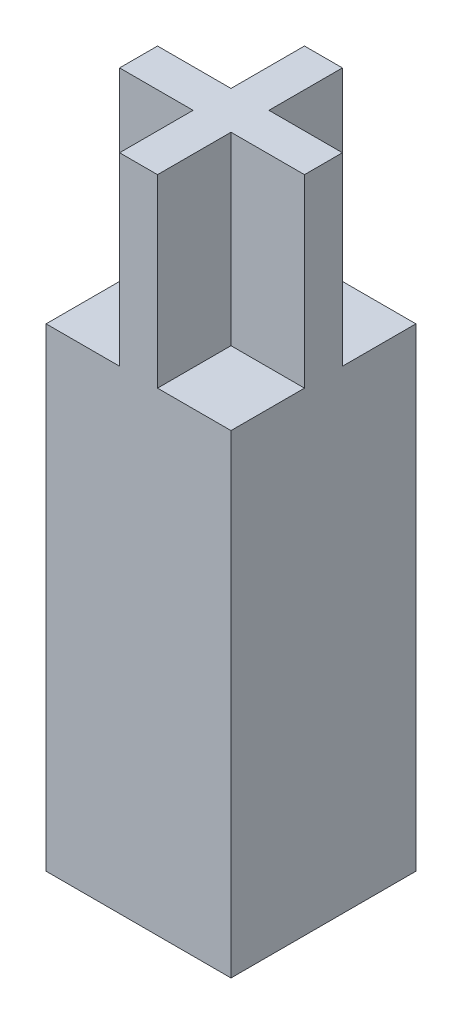
ISO-10303-21;
HEADER;
FILE_DESCRIPTION(('STEP AP214'),'2;1');
FILE_NAME('part.step','',(''),(''),'','','');
FILE_SCHEMA(('AUTOMOTIVE_DESIGN { 1 0 10303 214 1 1 1 1 }'));
ENDSEC;
DATA;
#1=APPLICATION_CONTEXT('core data for automotive mechanical design processes');
#2=APPLICATION_PROTOCOL_DEFINITION('international standard','automotive_design',2000,#1);
#3=PRODUCT_CONTEXT('',#1,'mechanical');
#4=PRODUCT('Part','Part','',(#3));
#5=PRODUCT_RELATED_PRODUCT_CATEGORY('part','',(#4));
#6=PRODUCT_DEFINITION_FORMATION('','',#4);
#7=PRODUCT_DEFINITION_CONTEXT('part definition',#1,'design');
#8=PRODUCT_DEFINITION('design','',#6,#7);
#9=PRODUCT_DEFINITION_SHAPE('','',#8);
#10=(LENGTH_UNIT() NAMED_UNIT(*) SI_UNIT(.MILLI.,.METRE.));
#11=(NAMED_UNIT(*) PLANE_ANGLE_UNIT() SI_UNIT($,.RADIAN.));
#12=(NAMED_UNIT(*) SI_UNIT($,.STERADIAN.) SOLID_ANGLE_UNIT());
#13=UNCERTAINTY_MEASURE_WITH_UNIT(LENGTH_MEASURE(1.E-05),#10,'distance_accuracy_value','');
#14=(GEOMETRIC_REPRESENTATION_CONTEXT(3) GLOBAL_UNCERTAINTY_ASSIGNED_CONTEXT((#13)) GLOBAL_UNIT_ASSIGNED_CONTEXT((#10,
#11,#12)) REPRESENTATION_CONTEXT('',''));
#15=CARTESIAN_POINT('',(0.,0.,0.));
#16=DIRECTION('',(0.,0.,1.));
#17=DIRECTION('',(1.,0.,0.));
#18=AXIS2_PLACEMENT_3D('',#15,#16,#17);
#19=CARTESIAN_POINT('',(1.95,3.9,0.4));
#20=DIRECTION('',(0.,0.,1.));
#21=DIRECTION('',(1.,0.,0.));
#22=AXIS2_PLACEMENT_3D('',#19,#20,#21);
#23=PLANE('',#22);
#24=DIRECTION('',(0.,1.,0.));
#25=VECTOR('',#24,1.);
#26=CARTESIAN_POINT('',(0.4,3.9,0.4));
#27=LINE('',#26,#25);
#28=CARTESIAN_POINT('',(0.4,0.,0.4));
#29=VERTEX_POINT('',#28);
#30=CARTESIAN_POINT('',(0.4,3.9,0.4));
#31=VERTEX_POINT('',#30);
#32=EDGE_CURVE('E181',#29,#31,#27,.T.);
#33=ORIENTED_EDGE('',*,*,#32,.F.);
#34=DIRECTION('',(-1.,0.,0.));
#35=VECTOR('',#34,1.);
#36=CARTESIAN_POINT('',(1.95,0.,0.4));
#37=LINE('',#36,#35);
#38=CARTESIAN_POINT('',(1.95,0.,0.4));
#39=VERTEX_POINT('',#38);
#40=EDGE_CURVE('E169',#39,#29,#37,.T.);
#41=ORIENTED_EDGE('',*,*,#40,.F.);
#42=DIRECTION('',(0.,-1.,0.));
#43=VECTOR('',#42,1.);
#44=CARTESIAN_POINT('',(1.95,3.9,0.4));
#45=LINE('',#44,#43);
#46=CARTESIAN_POINT('',(1.95,3.9,0.4));
#47=VERTEX_POINT('',#46);
#48=EDGE_CURVE('E115',#47,#39,#45,.T.);
#49=ORIENTED_EDGE('',*,*,#48,.F.);
#50=DIRECTION('',(-1.,0.,0.));
#51=VECTOR('',#50,1.);
#52=CARTESIAN_POINT('',(1.95,3.9,0.4));
#53=LINE('',#52,#51);
#54=EDGE_CURVE('E165',#47,#31,#53,.T.);
#55=ORIENTED_EDGE('',*,*,#54,.T.);
#56=EDGE_LOOP('',(#33,#41,#49,#55));
#57=FACE_BOUND('',#56,.T.);
#58=ADVANCED_FACE('F63',(#57),#23,.T.);
#59=CARTESIAN_POINT('',(1.95,3.9,-0.4));
#60=DIRECTION('',(1.,0.,0.));
#61=DIRECTION('',(0.,0.,-1.));
#62=AXIS2_PLACEMENT_3D('',#59,#60,#61);
#63=PLANE('',#62);
#64=ORIENTED_EDGE('',*,*,#48,.T.);
#65=DIRECTION('',(0.,0.,1.));
#66=VECTOR('',#65,1.);
#67=CARTESIAN_POINT('',(1.95,0.,-1.95));
#68=LINE('',#67,#66);
#69=CARTESIAN_POINT('',(1.95,0.,1.95));
#70=VERTEX_POINT('',#69);
#71=EDGE_CURVE('E336',#39,#70,#68,.T.);
#72=ORIENTED_EDGE('',*,*,#71,.T.);
#73=DIRECTION('',(0.,1.,0.));
#74=VECTOR('',#73,1.);
#75=CARTESIAN_POINT('',(1.95,-10.,1.95));
#76=LINE('',#75,#74);
#77=CARTESIAN_POINT('',(1.95,-10.,1.95));
#78=VERTEX_POINT('',#77);
#79=EDGE_CURVE('E218',#78,#70,#76,.T.);
#80=ORIENTED_EDGE('',*,*,#79,.F.);
#81=DIRECTION('',(0.,0.,1.));
#82=VECTOR('',#81,1.);
#83=CARTESIAN_POINT('',(1.95,-10.,-1.95));
#84=LINE('',#83,#82);
#85=CARTESIAN_POINT('',(1.95,-10.,-1.95));
#86=VERTEX_POINT('',#85);
#87=EDGE_CURVE('E259',#86,#78,#84,.T.);
#88=ORIENTED_EDGE('',*,*,#87,.F.);
#89=DIRECTION('',(0.,1.,0.));
#90=VECTOR('',#89,1.);
#91=CARTESIAN_POINT('',(1.95,-10.,-1.95));
#92=LINE('',#91,#90);
#93=CARTESIAN_POINT('',(1.95,0.,-1.95));
#94=VERTEX_POINT('',#93);
#95=EDGE_CURVE('E260',#86,#94,#92,.T.);
#96=ORIENTED_EDGE('',*,*,#95,.T.);
#97=CARTESIAN_POINT('',(1.95,0.,-0.4));
#98=VERTEX_POINT('',#97);
#99=EDGE_CURVE('E250',#94,#98,#68,.T.);
#100=ORIENTED_EDGE('',*,*,#99,.T.);
#101=DIRECTION('',(0.,-1.,0.));
#102=VECTOR('',#101,1.);
#103=CARTESIAN_POINT('',(1.95,3.9,-0.4));
#104=LINE('',#103,#102);
#105=CARTESIAN_POINT('',(1.95,3.9,-0.4));
#106=VERTEX_POINT('',#105);
#107=EDGE_CURVE('E178',#106,#98,#104,.T.);
#108=ORIENTED_EDGE('',*,*,#107,.F.);
#109=DIRECTION('',(0.,0.,1.));
#110=VECTOR('',#109,1.);
#111=CARTESIAN_POINT('',(1.95,3.9,-0.4));
#112=LINE('',#111,#110);
#113=EDGE_CURVE('E177',#106,#47,#112,.T.);
#114=ORIENTED_EDGE('',*,*,#113,.T.);
#115=EDGE_LOOP('',(#64,#72,#80,#88,#96,#100,#108,#114));
#116=FACE_BOUND('',#115,.T.);
#117=ADVANCED_FACE('F335',(#116),#63,.T.);
#118=CARTESIAN_POINT('',(1.95,3.9,-0.4));
#119=DIRECTION('',(0.,0.,1.));
#120=DIRECTION('',(1.,0.,0.));
#121=AXIS2_PLACEMENT_3D('',#118,#119,#120);
#122=PLANE('',#121);
#123=DIRECTION('',(-1.,0.,0.));
#124=VECTOR('',#123,1.);
#125=CARTESIAN_POINT('',(1.95,0.,-0.4));
#126=LINE('',#125,#124);
#127=CARTESIAN_POINT('',(0.4,0.,-0.4));
#128=VERTEX_POINT('',#127);
#129=EDGE_CURVE('E174',#98,#128,#126,.T.);
#130=ORIENTED_EDGE('',*,*,#129,.T.);
#131=DIRECTION('',(0.,1.,0.));
#132=VECTOR('',#131,1.);
#133=CARTESIAN_POINT('',(0.4,3.9,-0.4));
#134=LINE('',#133,#132);
#135=CARTESIAN_POINT('',(0.4,3.9,-0.4));
#136=VERTEX_POINT('',#135);
#137=EDGE_CURVE('E72',#128,#136,#134,.T.);
#138=ORIENTED_EDGE('',*,*,#137,.T.);
#139=DIRECTION('',(-1.,0.,0.));
#140=VECTOR('',#139,1.);
#141=CARTESIAN_POINT('',(1.95,3.9,-0.4));
#142=LINE('',#141,#140);
#143=EDGE_CURVE('E162',#106,#136,#142,.T.);
#144=ORIENTED_EDGE('',*,*,#143,.F.);
#145=ORIENTED_EDGE('',*,*,#107,.T.);
#146=EDGE_LOOP('',(#130,#138,#144,#145));
#147=FACE_BOUND('',#146,.T.);
#148=ADVANCED_FACE('F209',(#147),#122,.F.);
#149=CARTESIAN_POINT('',(0.,3.9,0.));
#150=DIRECTION('',(0.,-1.,0.));
#151=DIRECTION('',(0.,0.,-1.));
#152=AXIS2_PLACEMENT_3D('',#149,#150,#151);
#153=PLANE('',#152);
#154=ORIENTED_EDGE('',*,*,#143,.T.);
#155=DIRECTION('',(0.,0.,1.));
#156=VECTOR('',#155,1.);
#157=CARTESIAN_POINT('',(0.4,3.9,-1.95));
#158=LINE('',#157,#156);
#159=CARTESIAN_POINT('',(0.4,3.9,-1.95));
#160=VERTEX_POINT('',#159);
#161=EDGE_CURVE('E191',#160,#136,#158,.T.);
#162=ORIENTED_EDGE('',*,*,#161,.F.);
#163=DIRECTION('',(-1.,0.,0.));
#164=VECTOR('',#163,1.);
#165=CARTESIAN_POINT('',(0.4,3.9,-1.95));
#166=LINE('',#165,#164);
#167=CARTESIAN_POINT('',(-0.4,3.9,-1.95));
#168=VERTEX_POINT('',#167);
#169=EDGE_CURVE('E153',#160,#168,#166,.T.);
#170=ORIENTED_EDGE('',*,*,#169,.T.);
#171=DIRECTION('',(0.,0.,1.));
#172=VECTOR('',#171,1.);
#173=CARTESIAN_POINT('',(-0.4,3.9,-1.95));
#174=LINE('',#173,#172);
#175=CARTESIAN_POINT('',(-0.4,3.9,-0.4));
#176=VERTEX_POINT('',#175);
#177=EDGE_CURVE('E138',#168,#176,#174,.T.);
#178=ORIENTED_EDGE('',*,*,#177,.T.);
#179=CARTESIAN_POINT('',(-1.95,3.9,-0.4));
#180=VERTEX_POINT('',#179);
#181=EDGE_CURVE('E150',#176,#180,#142,.T.);
#182=ORIENTED_EDGE('',*,*,#181,.T.);
#183=DIRECTION('',(0.,0.,1.));
#184=VECTOR('',#183,1.);
#185=CARTESIAN_POINT('',(-1.95,3.9,-0.4));
#186=LINE('',#185,#184);
#187=CARTESIAN_POINT('',(-1.95,3.9,0.4));
#188=VERTEX_POINT('',#187);
#189=EDGE_CURVE('E163',#180,#188,#186,.T.);
#190=ORIENTED_EDGE('',*,*,#189,.T.);
#191=CARTESIAN_POINT('',(-0.4,3.9,0.4));
#192=VERTEX_POINT('',#191);
#193=EDGE_CURVE('E215',#192,#188,#53,.T.);
#194=ORIENTED_EDGE('',*,*,#193,.F.);
#195=CARTESIAN_POINT('',(-0.4,3.9,1.95));
#196=VERTEX_POINT('',#195);
#197=EDGE_CURVE('E156',#192,#196,#174,.T.);
#198=ORIENTED_EDGE('',*,*,#197,.T.);
#199=DIRECTION('',(-1.,0.,0.));
#200=VECTOR('',#199,1.);
#201=CARTESIAN_POINT('',(0.4,3.9,1.95));
#202=LINE('',#201,#200);
#203=CARTESIAN_POINT('',(0.4,3.9,1.95));
#204=VERTEX_POINT('',#203);
#205=EDGE_CURVE('E155',#204,#196,#202,.T.);
#206=ORIENTED_EDGE('',*,*,#205,.F.);
#207=EDGE_CURVE('E98',#31,#204,#158,.T.);
#208=ORIENTED_EDGE('',*,*,#207,.F.);
#209=ORIENTED_EDGE('',*,*,#54,.F.);
#210=ORIENTED_EDGE('',*,*,#113,.F.);
#211=EDGE_LOOP('',(#154,#162,#170,#178,#182,#190,#194,#198,#206,#208,#209,#210));
#212=FACE_BOUND('',#211,.T.);
#213=ADVANCED_FACE('F148',(#212),#153,.F.);
#214=CARTESIAN_POINT('',(-1.95,3.9,-0.4));
#215=DIRECTION('',(1.,0.,0.));
#216=DIRECTION('',(0.,0.,-1.));
#217=AXIS2_PLACEMENT_3D('',#214,#215,#216);
#218=PLANE('',#217);
#219=DIRECTION('',(0.,-1.,0.));
#220=VECTOR('',#219,1.);
#221=CARTESIAN_POINT('',(-1.95,3.9,-0.4));
#222=LINE('',#221,#220);
#223=CARTESIAN_POINT('',(-1.95,0.,-0.4));
#224=VERTEX_POINT('',#223);
#225=EDGE_CURVE('E160',#180,#224,#222,.T.);
#226=ORIENTED_EDGE('',*,*,#225,.T.);
#227=DIRECTION('',(0.,0.,-1.));
#228=VECTOR('',#227,1.);
#229=CARTESIAN_POINT('',(-1.95,0.,-1.95));
#230=LINE('',#229,#228);
#231=CARTESIAN_POINT('',(-1.95,0.,-1.95));
#232=VERTEX_POINT('',#231);
#233=EDGE_CURVE('E243',#224,#232,#230,.T.);
#234=ORIENTED_EDGE('',*,*,#233,.T.);
#235=DIRECTION('',(0.,1.,0.));
#236=VECTOR('',#235,1.);
#237=CARTESIAN_POINT('',(-1.95,-10.,-1.95));
#238=LINE('',#237,#236);
#239=CARTESIAN_POINT('',(-1.95,-10.,-1.95));
#240=VERTEX_POINT('',#239);
#241=EDGE_CURVE('E263',#240,#232,#238,.T.);
#242=ORIENTED_EDGE('',*,*,#241,.F.);
#243=DIRECTION('',(0.,0.,-1.));
#244=VECTOR('',#243,1.);
#245=CARTESIAN_POINT('',(-1.95,-10.,-1.95));
#246=LINE('',#245,#244);
#247=CARTESIAN_POINT('',(-1.95,-10.,1.95));
#248=VERTEX_POINT('',#247);
#249=EDGE_CURVE('E327',#248,#240,#246,.T.);
#250=ORIENTED_EDGE('',*,*,#249,.F.);
#251=DIRECTION('',(0.,1.,0.));
#252=VECTOR('',#251,1.);
#253=CARTESIAN_POINT('',(-1.95,-10.,1.95));
#254=LINE('',#253,#252);
#255=CARTESIAN_POINT('',(-1.95,0.,1.95));
#256=VERTEX_POINT('',#255);
#257=EDGE_CURVE('E266',#248,#256,#254,.T.);
#258=ORIENTED_EDGE('',*,*,#257,.T.);
#259=CARTESIAN_POINT('',(-1.95,0.,0.4));
#260=VERTEX_POINT('',#259);
#261=EDGE_CURVE('E247',#256,#260,#230,.T.);
#262=ORIENTED_EDGE('',*,*,#261,.T.);
#263=DIRECTION('',(0.,-1.,0.));
#264=VECTOR('',#263,1.);
#265=CARTESIAN_POINT('',(-1.95,3.9,0.4));
#266=LINE('',#265,#264);
#267=EDGE_CURVE('E183',#188,#260,#266,.T.);
#268=ORIENTED_EDGE('',*,*,#267,.F.);
#269=ORIENTED_EDGE('',*,*,#189,.F.);
#270=EDGE_LOOP('',(#226,#234,#242,#250,#258,#262,#268,#269));
#271=FACE_BOUND('',#270,.T.);
#272=ADVANCED_FACE('F288',(#271),#218,.F.);
#273=CARTESIAN_POINT('',(-0.4,0.,0.4));
#274=VERTEX_POINT('',#273);
#275=EDGE_CURVE('E173',#274,#260,#37,.T.);
#276=ORIENTED_EDGE('',*,*,#275,.F.);
#277=DIRECTION('',(0.,1.,0.));
#278=VECTOR('',#277,1.);
#279=CARTESIAN_POINT('',(-0.4,3.9,0.4));
#280=LINE('',#279,#278);
#281=EDGE_CURVE('E80',#274,#192,#280,.T.);
#282=ORIENTED_EDGE('',*,*,#281,.T.);
#283=ORIENTED_EDGE('',*,*,#193,.T.);
#284=ORIENTED_EDGE('',*,*,#267,.T.);
#285=EDGE_LOOP('',(#276,#282,#283,#284));
#286=FACE_BOUND('',#285,.T.);
#287=ADVANCED_FACE('F284',(#286),#23,.T.);
#288=DIRECTION('',(0.,1.,0.));
#289=VECTOR('',#288,1.);
#290=CARTESIAN_POINT('',(-0.4,3.9,-0.4));
#291=LINE('',#290,#289);
#292=CARTESIAN_POINT('',(-0.4,0.,-0.4));
#293=VERTEX_POINT('',#292);
#294=EDGE_CURVE('E12',#293,#176,#291,.T.);
#295=ORIENTED_EDGE('',*,*,#294,.F.);
#296=EDGE_CURVE('E172',#293,#224,#126,.T.);
#297=ORIENTED_EDGE('',*,*,#296,.T.);
#298=ORIENTED_EDGE('',*,*,#225,.F.);
#299=ORIENTED_EDGE('',*,*,#181,.F.);
#300=EDGE_LOOP('',(#295,#297,#298,#299));
#301=FACE_BOUND('',#300,.T.);
#302=ADVANCED_FACE('F158',(#301),#122,.F.);
#303=CARTESIAN_POINT('',(-0.4,3.9,-1.95));
#304=DIRECTION('',(1.,0.,0.));
#305=DIRECTION('',(0.,0.,-1.));
#306=AXIS2_PLACEMENT_3D('',#303,#304,#305);
#307=PLANE('',#306);
#308=ORIENTED_EDGE('',*,*,#281,.F.);
#309=DIRECTION('',(0.,0.,1.));
#310=VECTOR('',#309,1.);
#311=CARTESIAN_POINT('',(-0.4,0.,-1.95));
#312=LINE('',#311,#310);
#313=CARTESIAN_POINT('',(-0.4,0.,1.95));
#314=VERTEX_POINT('',#313);
#315=EDGE_CURVE('E195',#274,#314,#312,.T.);
#316=ORIENTED_EDGE('',*,*,#315,.T.);
#317=DIRECTION('',(0.,-1.,0.));
#318=VECTOR('',#317,1.);
#319=CARTESIAN_POINT('',(-0.4,3.9,1.95));
#320=LINE('',#319,#318);
#321=EDGE_CURVE('E200',#196,#314,#320,.T.);
#322=ORIENTED_EDGE('',*,*,#321,.F.);
#323=ORIENTED_EDGE('',*,*,#197,.F.);
#324=EDGE_LOOP('',(#308,#316,#322,#323));
#325=FACE_BOUND('',#324,.T.);
#326=ADVANCED_FACE('F277',(#325),#307,.F.);
#327=CARTESIAN_POINT('',(0.4,3.9,1.95));
#328=DIRECTION('',(0.,0.,1.));
#329=DIRECTION('',(1.,0.,0.));
#330=AXIS2_PLACEMENT_3D('',#327,#328,#329);
#331=PLANE('',#330);
#332=ORIENTED_EDGE('',*,*,#321,.T.);
#333=DIRECTION('',(-1.,0.,0.));
#334=VECTOR('',#333,1.);
#335=CARTESIAN_POINT('',(1.95,0.,1.95));
#336=LINE('',#335,#334);
#337=EDGE_CURVE('E244',#314,#256,#336,.T.);
#338=ORIENTED_EDGE('',*,*,#337,.T.);
#339=ORIENTED_EDGE('',*,*,#257,.F.);
#340=DIRECTION('',(-1.,0.,0.));
#341=VECTOR('',#340,1.);
#342=CARTESIAN_POINT('',(1.95,-10.,1.95));
#343=LINE('',#342,#341);
#344=EDGE_CURVE('E328',#78,#248,#343,.T.);
#345=ORIENTED_EDGE('',*,*,#344,.F.);
#346=ORIENTED_EDGE('',*,*,#79,.T.);
#347=CARTESIAN_POINT('',(0.4,0.,1.95));
#348=VERTEX_POINT('',#347);
#349=EDGE_CURVE('E233',#70,#348,#336,.T.);
#350=ORIENTED_EDGE('',*,*,#349,.T.);
#351=DIRECTION('',(0.,-1.,0.));
#352=VECTOR('',#351,1.);
#353=CARTESIAN_POINT('',(0.4,3.9,1.95));
#354=LINE('',#353,#352);
#355=EDGE_CURVE('E198',#204,#348,#354,.T.);
#356=ORIENTED_EDGE('',*,*,#355,.F.);
#357=ORIENTED_EDGE('',*,*,#205,.T.);
#358=EDGE_LOOP('',(#332,#338,#339,#345,#346,#350,#356,#357));
#359=FACE_BOUND('',#358,.T.);
#360=ADVANCED_FACE('F239',(#359),#331,.T.);
#361=CARTESIAN_POINT('',(0.4,3.9,-1.95));
#362=DIRECTION('',(1.,0.,0.));
#363=DIRECTION('',(0.,0.,-1.));
#364=AXIS2_PLACEMENT_3D('',#361,#362,#363);
#365=PLANE('',#364);
#366=DIRECTION('',(0.,0.,1.));
#367=VECTOR('',#366,1.);
#368=CARTESIAN_POINT('',(0.4,0.,-1.95));
#369=LINE('',#368,#367);
#370=EDGE_CURVE('E194',#29,#348,#369,.T.);
#371=ORIENTED_EDGE('',*,*,#370,.F.);
#372=ORIENTED_EDGE('',*,*,#32,.T.);
#373=ORIENTED_EDGE('',*,*,#207,.T.);
#374=ORIENTED_EDGE('',*,*,#355,.T.);
#375=EDGE_LOOP('',(#371,#372,#373,#374));
#376=FACE_BOUND('',#375,.T.);
#377=ADVANCED_FACE('F225',(#376),#365,.T.);
#378=CARTESIAN_POINT('',(0.4,3.9,-1.95));
#379=DIRECTION('',(0.,0.,1.));
#380=DIRECTION('',(1.,0.,0.));
#381=AXIS2_PLACEMENT_3D('',#378,#379,#380);
#382=PLANE('',#381);
#383=DIRECTION('',(0.,-1.,0.));
#384=VECTOR('',#383,1.);
#385=CARTESIAN_POINT('',(0.4,3.9,-1.95));
#386=LINE('',#385,#384);
#387=CARTESIAN_POINT('',(0.4,0.,-1.95));
#388=VERTEX_POINT('',#387);
#389=EDGE_CURVE('E106',#160,#388,#386,.T.);
#390=ORIENTED_EDGE('',*,*,#389,.T.);
#391=DIRECTION('',(1.,0.,0.));
#392=VECTOR('',#391,1.);
#393=CARTESIAN_POINT('',(1.95,0.,-1.95));
#394=LINE('',#393,#392);
#395=EDGE_CURVE('E255',#388,#94,#394,.T.);
#396=ORIENTED_EDGE('',*,*,#395,.T.);
#397=ORIENTED_EDGE('',*,*,#95,.F.);
#398=DIRECTION('',(1.,0.,0.));
#399=VECTOR('',#398,1.);
#400=CARTESIAN_POINT('',(1.95,-10.,-1.95));
#401=LINE('',#400,#399);
#402=EDGE_CURVE('E264',#240,#86,#401,.T.);
#403=ORIENTED_EDGE('',*,*,#402,.F.);
#404=ORIENTED_EDGE('',*,*,#241,.T.);
#405=CARTESIAN_POINT('',(-0.4,0.,-1.95));
#406=VERTEX_POINT('',#405);
#407=EDGE_CURVE('E256',#232,#406,#394,.T.);
#408=ORIENTED_EDGE('',*,*,#407,.T.);
#409=DIRECTION('',(0.,-1.,0.));
#410=VECTOR('',#409,1.);
#411=CARTESIAN_POINT('',(-0.4,3.9,-1.95));
#412=LINE('',#411,#410);
#413=EDGE_CURVE('E203',#168,#406,#412,.T.);
#414=ORIENTED_EDGE('',*,*,#413,.F.);
#415=ORIENTED_EDGE('',*,*,#169,.F.);
#416=EDGE_LOOP('',(#390,#396,#397,#403,#404,#408,#414,#415));
#417=FACE_BOUND('',#416,.T.);
#418=ADVANCED_FACE('F65',(#417),#382,.F.);
#419=EDGE_CURVE('E142',#406,#293,#312,.T.);
#420=ORIENTED_EDGE('',*,*,#419,.T.);
#421=ORIENTED_EDGE('',*,*,#294,.T.);
#422=ORIENTED_EDGE('',*,*,#177,.F.);
#423=ORIENTED_EDGE('',*,*,#413,.T.);
#424=EDGE_LOOP('',(#420,#421,#422,#423));
#425=FACE_BOUND('',#424,.T.);
#426=ADVANCED_FACE('F136',(#425),#307,.F.);
#427=ORIENTED_EDGE('',*,*,#137,.F.);
#428=EDGE_CURVE('E187',#388,#128,#369,.T.);
#429=ORIENTED_EDGE('',*,*,#428,.F.);
#430=ORIENTED_EDGE('',*,*,#389,.F.);
#431=ORIENTED_EDGE('',*,*,#161,.T.);
#432=EDGE_LOOP('',(#427,#429,#430,#431));
#433=FACE_BOUND('',#432,.T.);
#434=ADVANCED_FACE('F212',(#433),#365,.T.);
#435=CARTESIAN_POINT('',(0.,0.,0.));
#436=DIRECTION('',(0.,-1.,0.));
#437=DIRECTION('',(0.,0.,-1.));
#438=AXIS2_PLACEMENT_3D('',#435,#436,#437);
#439=PLANE('',#438);
#440=ORIENTED_EDGE('',*,*,#71,.F.);
#441=ORIENTED_EDGE('',*,*,#40,.T.);
#442=ORIENTED_EDGE('',*,*,#370,.T.);
#443=ORIENTED_EDGE('',*,*,#349,.F.);
#444=EDGE_LOOP('',(#440,#441,#442,#443));
#445=FACE_BOUND('',#444,.T.);
#446=ADVANCED_FACE('F231',(#445),#439,.F.);
#447=ORIENTED_EDGE('',*,*,#315,.F.);
#448=ORIENTED_EDGE('',*,*,#275,.T.);
#449=ORIENTED_EDGE('',*,*,#261,.F.);
#450=ORIENTED_EDGE('',*,*,#337,.F.);
#451=EDGE_LOOP('',(#447,#448,#449,#450));
#452=FACE_BOUND('',#451,.T.);
#453=ADVANCED_FACE('F289',(#452),#439,.F.);
#454=ORIENTED_EDGE('',*,*,#395,.F.);
#455=ORIENTED_EDGE('',*,*,#428,.T.);
#456=ORIENTED_EDGE('',*,*,#129,.F.);
#457=ORIENTED_EDGE('',*,*,#99,.F.);
#458=EDGE_LOOP('',(#454,#455,#456,#457));
#459=FACE_BOUND('',#458,.T.);
#460=ADVANCED_FACE('F340',(#459),#439,.F.);
#461=CARTESIAN_POINT('',(0.,-10.,0.));
#462=DIRECTION('',(0.,-1.,0.));
#463=DIRECTION('',(0.,0.,-1.));
#464=AXIS2_PLACEMENT_3D('',#461,#462,#463);
#465=PLANE('',#464);
#466=ORIENTED_EDGE('',*,*,#87,.T.);
#467=ORIENTED_EDGE('',*,*,#344,.T.);
#468=ORIENTED_EDGE('',*,*,#249,.T.);
#469=ORIENTED_EDGE('',*,*,#402,.T.);
#470=EDGE_LOOP('',(#466,#467,#468,#469));
#471=FACE_BOUND('',#470,.T.);
#472=ADVANCED_FACE('F333',(#471),#465,.T.);
#473=ORIENTED_EDGE('',*,*,#296,.F.);
#474=ORIENTED_EDGE('',*,*,#419,.F.);
#475=ORIENTED_EDGE('',*,*,#407,.F.);
#476=ORIENTED_EDGE('',*,*,#233,.F.);
#477=EDGE_LOOP('',(#473,#474,#475,#476));
#478=FACE_BOUND('',#477,.T.);
#479=ADVANCED_FACE('F313',(#478),#439,.F.);
#480=CLOSED_SHELL('',(#58,#117,#148,#213,#272,#287,#302,#326,#360,#377,#418,#426,#434,#446,#453,
#460,#472,#479));
#481=MANIFOLD_SOLID_BREP('B2',#480);
#482=ADVANCED_BREP_SHAPE_REPRESENTATION('',(#18,#481),#14);
#483=SHAPE_DEFINITION_REPRESENTATION(#9,#482);
ENDSEC;
END-ISO-10303-21;
